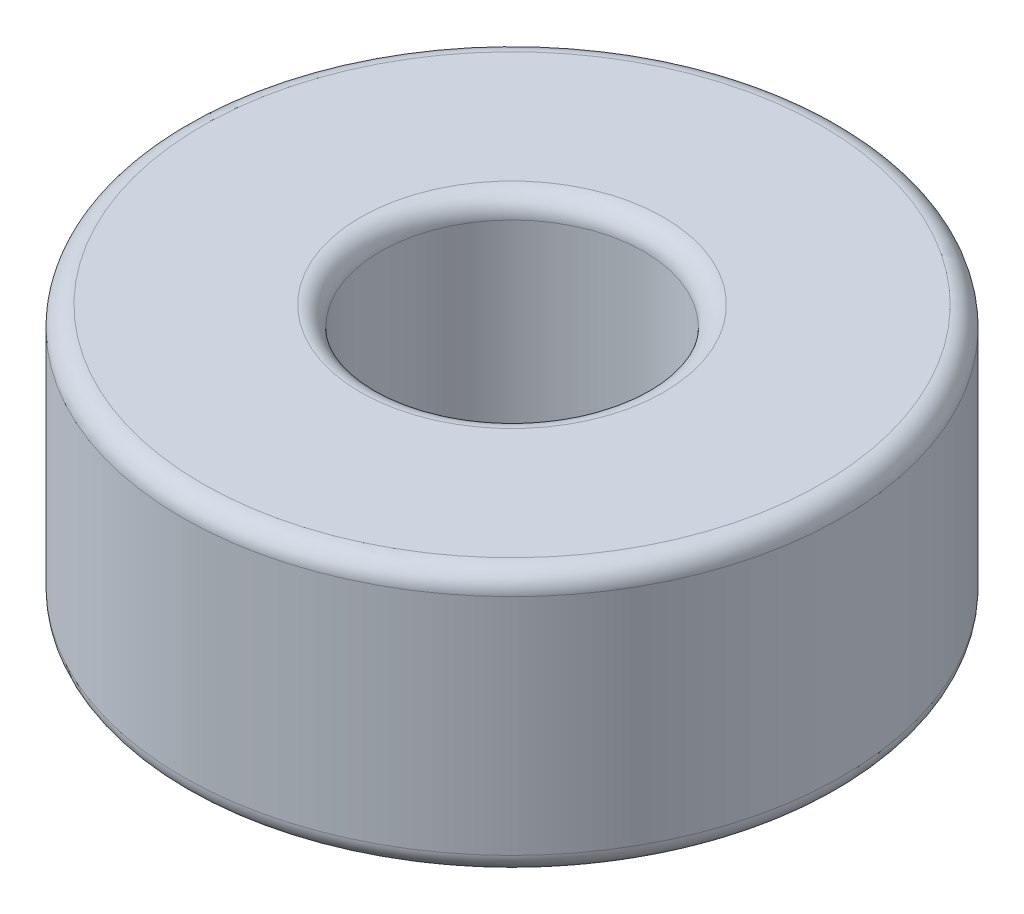
ISO-10303-21;
HEADER;
FILE_DESCRIPTION(('STEP AP214'),'2;1');
FILE_NAME('part.step','',(''),(''),'','','');
FILE_SCHEMA(('AUTOMOTIVE_DESIGN { 1 0 10303 214 1 1 1 1 }'));
ENDSEC;
DATA;
#1=APPLICATION_CONTEXT('core data for automotive mechanical design processes');
#2=APPLICATION_PROTOCOL_DEFINITION('international standard','automotive_design',2000,#1);
#3=PRODUCT_CONTEXT('',#1,'mechanical');
#4=PRODUCT('Part','Part','',(#3));
#5=PRODUCT_RELATED_PRODUCT_CATEGORY('part','',(#4));
#6=PRODUCT_DEFINITION_FORMATION('','',#4);
#7=PRODUCT_DEFINITION_CONTEXT('part definition',#1,'design');
#8=PRODUCT_DEFINITION('design','',#6,#7);
#9=PRODUCT_DEFINITION_SHAPE('','',#8);
#10=(LENGTH_UNIT() NAMED_UNIT(*) SI_UNIT(.MILLI.,.METRE.));
#11=(NAMED_UNIT(*) PLANE_ANGLE_UNIT() SI_UNIT($,.RADIAN.));
#12=(NAMED_UNIT(*) SI_UNIT($,.STERADIAN.) SOLID_ANGLE_UNIT());
#13=UNCERTAINTY_MEASURE_WITH_UNIT(LENGTH_MEASURE(1.E-05),#10,'distance_accuracy_value','');
#14=(GEOMETRIC_REPRESENTATION_CONTEXT(3) GLOBAL_UNCERTAINTY_ASSIGNED_CONTEXT((#13)) GLOBAL_UNIT_ASSIGNED_CONTEXT((#10,
#11,#12)) REPRESENTATION_CONTEXT('',''));
#15=CARTESIAN_POINT('',(0.,0.,0.));
#16=DIRECTION('',(0.,0.,1.));
#17=DIRECTION('',(1.,0.,0.));
#18=AXIS2_PLACEMENT_3D('',#15,#16,#17);
#19=CARTESIAN_POINT('',(-50.3383644720024,4.,-5.67920009427719));
#20=DIRECTION('',(0.,1.,0.));
#21=DIRECTION('',(0.,0.,1.));
#22=AXIS2_PLACEMENT_3D('',#19,#20,#21);
#23=PLANE('',#22);
#24=CARTESIAN_POINT('',(-50.3383644720024,4.,-5.67920009427719));
#25=DIRECTION('',(0.,1.,0.));
#26=DIRECTION('',(0.,0.,1.));
#27=AXIS2_PLACEMENT_3D('',#24,#25,#26);
#28=CIRCLE('',#27,2.3);
#29=CARTESIAN_POINT('',(-50.3383644720024,4.,-3.37920009427719));
#30=VERTEX_POINT('',#29);
#31=EDGE_CURVE('E50',#30,#30,#28,.F.);
#32=ORIENTED_EDGE('',*,*,#31,.T.);
#33=EDGE_LOOP('',(#32));
#34=FACE_BOUND('',#33,.T.);
#35=CARTESIAN_POINT('',(-50.3383644720024,4.,-5.67920009427719));
#36=DIRECTION('',(0.,1.,0.));
#37=DIRECTION('',(0.,0.,1.));
#38=AXIS2_PLACEMENT_3D('',#35,#36,#37);
#39=CIRCLE('',#38,4.7);
#40=CARTESIAN_POINT('',(-50.3383644720024,4.,-0.979200094277195));
#41=VERTEX_POINT('',#40);
#42=EDGE_CURVE('E55',#41,#41,#39,.T.);
#43=ORIENTED_EDGE('',*,*,#42,.T.);
#44=EDGE_LOOP('',(#43));
#45=FACE_BOUND('',#44,.T.);
#46=ADVANCED_FACE('F37',(#34,#45),#23,.T.);
#47=CARTESIAN_POINT('',(-50.3383644720024,0.,-5.67920009427719));
#48=DIRECTION('',(0.,1.,0.));
#49=DIRECTION('',(0.,0.,1.));
#50=AXIS2_PLACEMENT_3D('',#47,#48,#49);
#51=PLANE('',#50);
#52=CARTESIAN_POINT('',(-50.3383644720024,0.,-5.67920009427719));
#53=DIRECTION('',(0.,1.,0.));
#54=DIRECTION('',(0.,0.,1.));
#55=AXIS2_PLACEMENT_3D('',#52,#53,#54);
#56=CIRCLE('',#55,2.3);
#57=CARTESIAN_POINT('',(-50.3383644720024,0.,-3.37920009427719));
#58=VERTEX_POINT('',#57);
#59=EDGE_CURVE('E69',#58,#58,#56,.T.);
#60=ORIENTED_EDGE('',*,*,#59,.T.);
#61=EDGE_LOOP('',(#60));
#62=FACE_BOUND('',#61,.T.);
#63=CARTESIAN_POINT('',(-50.3383644720024,0.,-5.67920009427719));
#64=DIRECTION('',(0.,1.,0.));
#65=DIRECTION('',(0.,0.,1.));
#66=AXIS2_PLACEMENT_3D('',#63,#64,#65);
#67=CIRCLE('',#66,4.7);
#68=CARTESIAN_POINT('',(-50.3383644720024,0.,-0.979200094277195));
#69=VERTEX_POINT('',#68);
#70=EDGE_CURVE('E73',#69,#69,#67,.F.);
#71=ORIENTED_EDGE('',*,*,#70,.T.);
#72=EDGE_LOOP('',(#71));
#73=FACE_BOUND('',#72,.T.);
#74=ADVANCED_FACE('F78',(#62,#73),#51,.F.);
#75=CARTESIAN_POINT('',(-50.3383644720024,4.,-5.67920009427719));
#76=DIRECTION('',(0.,-1.,0.));
#77=DIRECTION('',(0.,0.,-1.));
#78=AXIS2_PLACEMENT_3D('',#75,#76,#77);
#79=CYLINDRICAL_SURFACE('',#78,5.);
#80=CARTESIAN_POINT('',(-50.3383644720024,0.3,-5.67920009427719));
#81=DIRECTION('',(0.,1.,0.));
#82=DIRECTION('',(0.,0.,1.));
#83=AXIS2_PLACEMENT_3D('',#80,#81,#82);
#84=CIRCLE('',#83,5.);
#85=CARTESIAN_POINT('',(-50.3383644720024,0.3,-0.679200094277195));
#86=VERTEX_POINT('',#85);
#87=EDGE_CURVE('E10',#86,#86,#84,.T.);
#88=ORIENTED_EDGE('',*,*,#87,.T.);
#89=EDGE_LOOP('',(#88));
#90=FACE_BOUND('',#89,.T.);
#91=CARTESIAN_POINT('',(-50.3383644720024,3.7,-5.67920009427719));
#92=DIRECTION('',(0.,1.,0.));
#93=DIRECTION('',(0.,0.,1.));
#94=AXIS2_PLACEMENT_3D('',#91,#92,#93);
#95=CIRCLE('',#94,5.);
#96=CARTESIAN_POINT('',(-50.3383644720024,3.7,-0.679200094277195));
#97=VERTEX_POINT('',#96);
#98=EDGE_CURVE('E45',#97,#97,#95,.F.);
#99=ORIENTED_EDGE('',*,*,#98,.T.);
#100=EDGE_LOOP('',(#99));
#101=FACE_BOUND('',#100,.T.);
#102=ADVANCED_FACE('F98',(#90,#101),#79,.T.);
#103=CARTESIAN_POINT('',(-50.3383644720024,4.,-5.67920009427719));
#104=DIRECTION('',(0.,-1.,0.));
#105=DIRECTION('',(0.,0.,-1.));
#106=AXIS2_PLACEMENT_3D('',#103,#104,#105);
#107=CYLINDRICAL_SURFACE('',#106,2.);
#108=CARTESIAN_POINT('',(-50.3383644720024,0.3,-5.67920009427719));
#109=DIRECTION('',(0.,1.,0.));
#110=DIRECTION('',(0.,0.,1.));
#111=AXIS2_PLACEMENT_3D('',#108,#109,#110);
#112=CIRCLE('',#111,2.);
#113=CARTESIAN_POINT('',(-50.3383644720024,0.3,-3.67920009427719));
#114=VERTEX_POINT('',#113);
#115=EDGE_CURVE('E61',#114,#114,#112,.F.);
#116=ORIENTED_EDGE('',*,*,#115,.T.);
#117=EDGE_LOOP('',(#116));
#118=FACE_BOUND('',#117,.T.);
#119=CARTESIAN_POINT('',(-50.3383644720024,3.7,-5.67920009427719));
#120=DIRECTION('',(0.,1.,0.));
#121=DIRECTION('',(0.,0.,1.));
#122=AXIS2_PLACEMENT_3D('',#119,#120,#121);
#123=CIRCLE('',#122,2.);
#124=CARTESIAN_POINT('',(-50.3383644720024,3.7,-3.67920009427719));
#125=VERTEX_POINT('',#124);
#126=EDGE_CURVE('E65',#125,#125,#123,.T.);
#127=ORIENTED_EDGE('',*,*,#126,.T.);
#128=EDGE_LOOP('',(#127));
#129=FACE_BOUND('',#128,.T.);
#130=ADVANCED_FACE('F103',(#118,#129),#107,.F.);
#131=CARTESIAN_POINT('',(-50.3383644720024,0.3,-5.67920009427719));
#132=DIRECTION('',(0.,1.,0.));
#133=DIRECTION('',(0.,0.,1.));
#134=AXIS2_PLACEMENT_3D('',#131,#132,#133);
#135=TOROIDAL_SURFACE('',#134,2.3,0.3);
#136=ORIENTED_EDGE('',*,*,#115,.F.);
#137=EDGE_LOOP('',(#136));
#138=FACE_BOUND('',#137,.T.);
#139=ORIENTED_EDGE('',*,*,#59,.F.);
#140=EDGE_LOOP('',(#139));
#141=FACE_BOUND('',#140,.T.);
#142=ADVANCED_FACE('F89',(#138,#141),#135,.T.);
#143=CARTESIAN_POINT('',(-50.3383644720024,3.7,-5.67920009427719));
#144=DIRECTION('',(0.,1.,0.));
#145=DIRECTION('',(0.,0.,1.));
#146=AXIS2_PLACEMENT_3D('',#143,#144,#145);
#147=TOROIDAL_SURFACE('',#146,2.3,0.3);
#148=ORIENTED_EDGE('',*,*,#31,.F.);
#149=EDGE_LOOP('',(#148));
#150=FACE_BOUND('',#149,.T.);
#151=ORIENTED_EDGE('',*,*,#126,.F.);
#152=EDGE_LOOP('',(#151));
#153=FACE_BOUND('',#152,.T.);
#154=ADVANCED_FACE('F83',(#150,#153),#147,.T.);
#155=CARTESIAN_POINT('',(-50.3383644720024,0.3,-5.67920009427719));
#156=DIRECTION('',(0.,1.,0.));
#157=DIRECTION('',(0.,0.,1.));
#158=AXIS2_PLACEMENT_3D('',#155,#156,#157);
#159=TOROIDAL_SURFACE('',#158,4.7,0.3);
#160=ORIENTED_EDGE('',*,*,#70,.F.);
#161=EDGE_LOOP('',(#160));
#162=FACE_BOUND('',#161,.T.);
#163=ORIENTED_EDGE('',*,*,#87,.F.);
#164=EDGE_LOOP('',(#163));
#165=FACE_BOUND('',#164,.T.);
#166=ADVANCED_FACE('F80',(#162,#165),#159,.T.);
#167=CARTESIAN_POINT('',(-50.3383644720024,3.7,-5.67920009427719));
#168=DIRECTION('',(0.,1.,0.));
#169=DIRECTION('',(0.,0.,1.));
#170=AXIS2_PLACEMENT_3D('',#167,#168,#169);
#171=TOROIDAL_SURFACE('',#170,4.7,0.3);
#172=ORIENTED_EDGE('',*,*,#98,.F.);
#173=EDGE_LOOP('',(#172));
#174=FACE_BOUND('',#173,.T.);
#175=ORIENTED_EDGE('',*,*,#42,.F.);
#176=EDGE_LOOP('',(#175));
#177=FACE_BOUND('',#176,.T.);
#178=ADVANCED_FACE('F39',(#174,#177),#171,.T.);
#179=CLOSED_SHELL('',(#46,#74,#102,#130,#142,#154,#166,#178));
#180=MANIFOLD_SOLID_BREP('B2',#179);
#181=ADVANCED_BREP_SHAPE_REPRESENTATION('',(#18,#180),#14);
#182=SHAPE_DEFINITION_REPRESENTATION(#9,#181);
ENDSEC;
END-ISO-10303-21;
